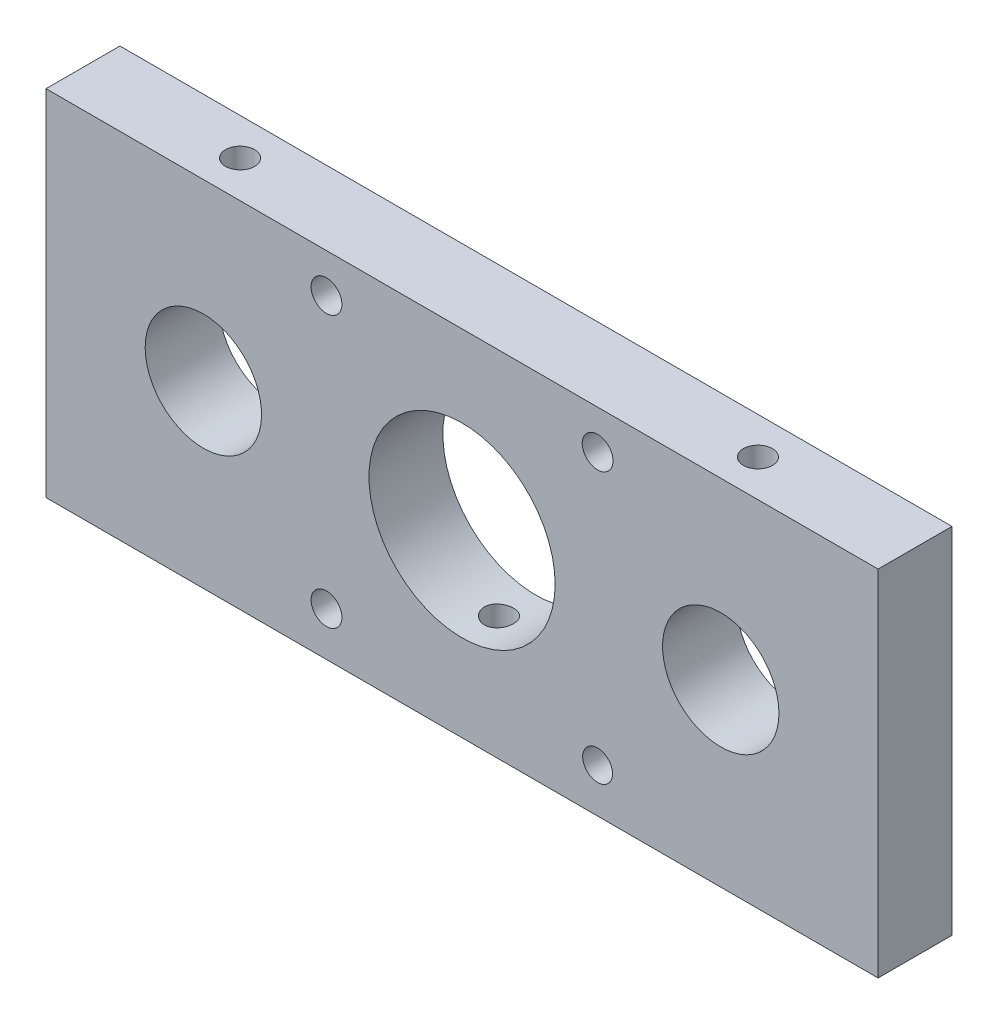
ISO-10303-21;
HEADER;
FILE_DESCRIPTION(('STEP AP214'),'2;1');
FILE_NAME('part.step','',(''),(''),'','','');
FILE_SCHEMA(('AUTOMOTIVE_DESIGN { 1 0 10303 214 1 1 1 1 }'));
ENDSEC;
DATA;
#1=APPLICATION_CONTEXT('core data for automotive mechanical design processes');
#2=APPLICATION_PROTOCOL_DEFINITION('international standard','automotive_design',2000,#1);
#3=PRODUCT_CONTEXT('',#1,'mechanical');
#4=PRODUCT('Part','Part','',(#3));
#5=PRODUCT_RELATED_PRODUCT_CATEGORY('part','',(#4));
#6=PRODUCT_DEFINITION_FORMATION('','',#4);
#7=PRODUCT_DEFINITION_CONTEXT('part definition',#1,'design');
#8=PRODUCT_DEFINITION('design','',#6,#7);
#9=PRODUCT_DEFINITION_SHAPE('','',#8);
#10=(LENGTH_UNIT() NAMED_UNIT(*) SI_UNIT(.MILLI.,.METRE.));
#11=(NAMED_UNIT(*) PLANE_ANGLE_UNIT() SI_UNIT($,.RADIAN.));
#12=(NAMED_UNIT(*) SI_UNIT($,.STERADIAN.) SOLID_ANGLE_UNIT());
#13=UNCERTAINTY_MEASURE_WITH_UNIT(LENGTH_MEASURE(1.E-05),#10,'distance_accuracy_value','');
#14=(GEOMETRIC_REPRESENTATION_CONTEXT(3) GLOBAL_UNCERTAINTY_ASSIGNED_CONTEXT((#13)) GLOBAL_UNIT_ASSIGNED_CONTEXT((#10,
#11,#12)) REPRESENTATION_CONTEXT('',''));
#15=CARTESIAN_POINT('',(0.,0.,0.));
#16=DIRECTION('',(0.,0.,1.));
#17=DIRECTION('',(1.,0.,0.));
#18=AXIS2_PLACEMENT_3D('',#15,#16,#17);
#19=CARTESIAN_POINT('',(-71.505,27.,10.));
#20=DIRECTION('',(1.,0.,0.));
#21=DIRECTION('',(0.,0.,-1.));
#22=AXIS2_PLACEMENT_3D('',#19,#20,#21);
#23=PLANE('',#22);
#24=DIRECTION('',(0.,-1.,0.));
#25=VECTOR('',#24,1.);
#26=CARTESIAN_POINT('',(-71.505,27.,10.));
#27=LINE('',#26,#25);
#28=CARTESIAN_POINT('',(-71.505,30.,10.));
#29=VERTEX_POINT('',#28);
#30=CARTESIAN_POINT('',(-71.505,-30.87,10.));
#31=VERTEX_POINT('',#30);
#32=EDGE_CURVE('E43',#29,#31,#27,.T.);
#33=ORIENTED_EDGE('',*,*,#32,.F.);
#34=DIRECTION('',(0.,0.,1.));
#35=VECTOR('',#34,1.);
#36=CARTESIAN_POINT('',(-71.505,30.,-145.741462870036));
#37=LINE('',#36,#35);
#38=CARTESIAN_POINT('',(-71.505,30.,-2.70000000000001));
#39=VERTEX_POINT('',#38);
#40=EDGE_CURVE('E77',#39,#29,#37,.T.);
#41=ORIENTED_EDGE('',*,*,#40,.F.);
#42=DIRECTION('',(0.,-1.,0.));
#43=VECTOR('',#42,1.);
#44=CARTESIAN_POINT('',(-71.505,27.,-2.7));
#45=LINE('',#44,#43);
#46=CARTESIAN_POINT('',(-71.505,-30.87,-2.69999999999999));
#47=VERTEX_POINT('',#46);
#48=EDGE_CURVE('E123',#39,#47,#45,.T.);
#49=ORIENTED_EDGE('',*,*,#48,.T.);
#50=DIRECTION('',(0.,0.,1.));
#51=VECTOR('',#50,1.);
#52=CARTESIAN_POINT('',(-71.505,-30.87,0.));
#53=LINE('',#52,#51);
#54=EDGE_CURVE('E80',#47,#31,#53,.T.);
#55=ORIENTED_EDGE('',*,*,#54,.T.);
#56=EDGE_LOOP('',(#33,#41,#49,#55));
#57=FACE_BOUND('',#56,.T.);
#58=ADVANCED_FACE('F31',(#57),#23,.F.);
#59=CARTESIAN_POINT('',(71.505,27.,10.));
#60=DIRECTION('',(-1.,0.,0.));
#61=DIRECTION('',(0.,0.,1.));
#62=AXIS2_PLACEMENT_3D('',#59,#60,#61);
#63=PLANE('',#62);
#64=DIRECTION('',(0.,1.,0.));
#65=VECTOR('',#64,1.);
#66=CARTESIAN_POINT('',(71.505,27.,10.));
#67=LINE('',#66,#65);
#68=CARTESIAN_POINT('',(71.505,-30.87,10.));
#69=VERTEX_POINT('',#68);
#70=CARTESIAN_POINT('',(71.505,30.,10.));
#71=VERTEX_POINT('',#70);
#72=EDGE_CURVE('E11',#69,#71,#67,.T.);
#73=ORIENTED_EDGE('',*,*,#72,.F.);
#74=DIRECTION('',(0.,0.,-1.));
#75=VECTOR('',#74,1.);
#76=CARTESIAN_POINT('',(71.505,-30.87,0.));
#77=LINE('',#76,#75);
#78=CARTESIAN_POINT('',(71.505,-30.87,-2.69999999999999));
#79=VERTEX_POINT('',#78);
#80=EDGE_CURVE('E51',#69,#79,#77,.T.);
#81=ORIENTED_EDGE('',*,*,#80,.T.);
#82=DIRECTION('',(0.,1.,0.));
#83=VECTOR('',#82,1.);
#84=CARTESIAN_POINT('',(71.505,27.,-2.7));
#85=LINE('',#84,#83);
#86=CARTESIAN_POINT('',(71.505,30.,-2.70000000000001));
#87=VERTEX_POINT('',#86);
#88=EDGE_CURVE('E120',#79,#87,#85,.T.);
#89=ORIENTED_EDGE('',*,*,#88,.T.);
#90=DIRECTION('',(0.,0.,1.));
#91=VECTOR('',#90,1.);
#92=CARTESIAN_POINT('',(71.505,30.,-145.741462870036));
#93=LINE('',#92,#91);
#94=EDGE_CURVE('E97',#87,#71,#93,.T.);
#95=ORIENTED_EDGE('',*,*,#94,.T.);
#96=EDGE_LOOP('',(#73,#81,#89,#95));
#97=FACE_BOUND('',#96,.T.);
#98=ADVANCED_FACE('F153',(#97),#63,.F.);
#99=CARTESIAN_POINT('',(-71.505,-27.,10.));
#100=DIRECTION('',(0.,0.,1.));
#101=DIRECTION('',(1.,0.,0.));
#102=AXIS2_PLACEMENT_3D('',#99,#100,#101);
#103=PLANE('',#102);
#104=CARTESIAN_POINT('',(-23.3,23.2999999999833,10.));
#105=DIRECTION('',(0.,0.,1.));
#106=DIRECTION('',(1.,0.,0.));
#107=AXIS2_PLACEMENT_3D('',#104,#105,#106);
#108=CIRCLE('',#107,2.65000000000001);
#109=CARTESIAN_POINT('',(-20.65,23.2999999999833,10.));
#110=VERTEX_POINT('',#109);
#111=EDGE_CURVE('E377',#110,#110,#108,.T.);
#112=ORIENTED_EDGE('',*,*,#111,.F.);
#113=EDGE_LOOP('',(#112));
#114=FACE_BOUND('',#113,.T.);
#115=CARTESIAN_POINT('',(-23.3,-23.3000000000167,10.));
#116=DIRECTION('',(0.,0.,1.));
#117=DIRECTION('',(1.,0.,0.));
#118=AXIS2_PLACEMENT_3D('',#115,#116,#117);
#119=CIRCLE('',#118,2.65000000000001);
#120=CARTESIAN_POINT('',(-20.65,-23.3000000000167,10.));
#121=VERTEX_POINT('',#120);
#122=EDGE_CURVE('E371',#121,#121,#119,.T.);
#123=ORIENTED_EDGE('',*,*,#122,.F.);
#124=EDGE_LOOP('',(#123));
#125=FACE_BOUND('',#124,.T.);
#126=CARTESIAN_POINT('',(23.3,23.2999999999833,10.));
#127=DIRECTION('',(0.,0.,1.));
#128=DIRECTION('',(1.,0.,0.));
#129=AXIS2_PLACEMENT_3D('',#126,#127,#128);
#130=CIRCLE('',#129,2.64999999999999);
#131=CARTESIAN_POINT('',(25.95,23.2999999999833,10.));
#132=VERTEX_POINT('',#131);
#133=EDGE_CURVE('E365',#132,#132,#130,.T.);
#134=ORIENTED_EDGE('',*,*,#133,.F.);
#135=EDGE_LOOP('',(#134));
#136=FACE_BOUND('',#135,.T.);
#137=CARTESIAN_POINT('',(23.3,-23.3000000000167,10.));
#138=DIRECTION('',(0.,0.,1.));
#139=DIRECTION('',(1.,0.,0.));
#140=AXIS2_PLACEMENT_3D('',#137,#138,#139);
#141=CIRCLE('',#140,2.56848992898384);
#142=CARTESIAN_POINT('',(25.8684899289839,-23.3000000000167,10.));
#143=VERTEX_POINT('',#142);
#144=EDGE_CURVE('E359',#143,#143,#141,.T.);
#145=ORIENTED_EDGE('',*,*,#144,.F.);
#146=EDGE_LOOP('',(#145));
#147=FACE_BOUND('',#146,.T.);
#148=CARTESIAN_POINT('',(-44.465,0.,10.));
#149=DIRECTION('',(0.,0.,1.));
#150=DIRECTION('',(-1.,0.,0.));
#151=AXIS2_PLACEMENT_3D('',#148,#149,#150);
#152=CIRCLE('',#151,10.);
#153=CARTESIAN_POINT('',(-54.465,0.,10.));
#154=VERTEX_POINT('',#153);
#155=EDGE_CURVE('E108',#154,#154,#152,.T.);
#156=ORIENTED_EDGE('',*,*,#155,.F.);
#157=EDGE_LOOP('',(#156));
#158=FACE_BOUND('',#157,.T.);
#159=CARTESIAN_POINT('',(44.465,0.,10.));
#160=DIRECTION('',(0.,0.,1.));
#161=DIRECTION('',(1.,0.,0.));
#162=AXIS2_PLACEMENT_3D('',#159,#160,#161);
#163=CIRCLE('',#162,10.);
#164=CARTESIAN_POINT('',(54.465,0.,10.));
#165=VERTEX_POINT('',#164);
#166=EDGE_CURVE('E112',#165,#165,#163,.T.);
#167=ORIENTED_EDGE('',*,*,#166,.F.);
#168=EDGE_LOOP('',(#167));
#169=FACE_BOUND('',#168,.T.);
#170=CARTESIAN_POINT('',(0.,0.,10.));
#171=DIRECTION('',(0.,0.,1.));
#172=DIRECTION('',(1.,0.,0.));
#173=AXIS2_PLACEMENT_3D('',#170,#171,#172);
#174=CIRCLE('',#173,16.);
#175=CARTESIAN_POINT('',(16.,0.,10.));
#176=VERTEX_POINT('',#175);
#177=EDGE_CURVE('E116',#176,#176,#174,.T.);
#178=ORIENTED_EDGE('',*,*,#177,.F.);
#179=EDGE_LOOP('',(#178));
#180=FACE_BOUND('',#179,.T.);
#181=ORIENTED_EDGE('',*,*,#32,.T.);
#182=DIRECTION('',(1.,0.,0.));
#183=VECTOR('',#182,1.);
#184=CARTESIAN_POINT('',(-71.505,-30.87,10.));
#185=LINE('',#184,#183);
#186=EDGE_CURVE('E93',#31,#69,#185,.T.);
#187=ORIENTED_EDGE('',*,*,#186,.T.);
#188=ORIENTED_EDGE('',*,*,#72,.T.);
#189=DIRECTION('',(-1.,0.,0.));
#190=VECTOR('',#189,1.);
#191=CARTESIAN_POINT('',(-71.505,30.,10.));
#192=LINE('',#191,#190);
#193=EDGE_CURVE('E90',#71,#29,#192,.T.);
#194=ORIENTED_EDGE('',*,*,#193,.T.);
#195=EDGE_LOOP('',(#181,#187,#188,#194));
#196=FACE_BOUND('',#195,.T.);
#197=ADVANCED_FACE('F95',(#114,#125,#136,#147,#158,#169,#180,#196),#103,.T.);
#198=CARTESIAN_POINT('',(129.437951763224,-30.87,0.));
#199=DIRECTION('',(0.,-1.,0.));
#200=DIRECTION('',(0.,0.,-1.));
#201=AXIS2_PLACEMENT_3D('',#198,#199,#200);
#202=PLANE('',#201);
#203=CARTESIAN_POINT('',(61.505,-30.87,3.65000000000002));
#204=DIRECTION('',(0.,-1.,0.));
#205=DIRECTION('',(0.,0.,1.));
#206=AXIS2_PLACEMENT_3D('',#203,#204,#205);
#207=CIRCLE('',#206,2.5);
#208=CARTESIAN_POINT('',(61.505,-30.87,6.15000000000002));
#209=VERTEX_POINT('',#208);
#210=EDGE_CURVE('E356',#209,#209,#207,.T.);
#211=ORIENTED_EDGE('',*,*,#210,.F.);
#212=EDGE_LOOP('',(#211));
#213=FACE_BOUND('',#212,.T.);
#214=CARTESIAN_POINT('',(33.505,-30.87,3.65000000000001));
#215=DIRECTION('',(0.,-1.,0.));
#216=DIRECTION('',(0.,0.,1.));
#217=AXIS2_PLACEMENT_3D('',#214,#215,#216);
#218=CIRCLE('',#217,2.49999999999999);
#219=CARTESIAN_POINT('',(33.505,-30.87,6.15000000000001));
#220=VERTEX_POINT('',#219);
#221=EDGE_CURVE('E350',#220,#220,#218,.T.);
#222=ORIENTED_EDGE('',*,*,#221,.F.);
#223=EDGE_LOOP('',(#222));
#224=FACE_BOUND('',#223,.T.);
#225=CARTESIAN_POINT('',(-33.505,-30.87,3.65));
#226=DIRECTION('',(0.,-1.,0.));
#227=DIRECTION('',(0.,0.,-1.));
#228=AXIS2_PLACEMENT_3D('',#225,#226,#227);
#229=CIRCLE('',#228,2.5);
#230=CARTESIAN_POINT('',(-33.505,-30.87,1.15));
#231=VERTEX_POINT('',#230);
#232=EDGE_CURVE('E344',#231,#231,#229,.T.);
#233=ORIENTED_EDGE('',*,*,#232,.F.);
#234=EDGE_LOOP('',(#233));
#235=FACE_BOUND('',#234,.T.);
#236=CARTESIAN_POINT('',(0.,-30.87,3.65));
#237=DIRECTION('',(0.,-1.,0.));
#238=DIRECTION('',(0.,0.,-1.));
#239=AXIS2_PLACEMENT_3D('',#236,#237,#238);
#240=CIRCLE('',#239,2.5);
#241=CARTESIAN_POINT('',(0.,-30.87,1.15));
#242=VERTEX_POINT('',#241);
#243=EDGE_CURVE('E337',#242,#242,#240,.T.);
#244=ORIENTED_EDGE('',*,*,#243,.F.);
#245=EDGE_LOOP('',(#244));
#246=FACE_BOUND('',#245,.T.);
#247=CARTESIAN_POINT('',(-61.505,-30.87,3.65));
#248=DIRECTION('',(0.,-1.,0.));
#249=DIRECTION('',(0.,0.,-1.));
#250=AXIS2_PLACEMENT_3D('',#247,#248,#249);
#251=CIRCLE('',#250,2.5);
#252=CARTESIAN_POINT('',(-61.505,-30.87,1.15));
#253=VERTEX_POINT('',#252);
#254=EDGE_CURVE('E102',#253,#253,#251,.T.);
#255=ORIENTED_EDGE('',*,*,#254,.F.);
#256=EDGE_LOOP('',(#255));
#257=FACE_BOUND('',#256,.T.);
#258=ORIENTED_EDGE('',*,*,#80,.F.);
#259=ORIENTED_EDGE('',*,*,#186,.F.);
#260=ORIENTED_EDGE('',*,*,#54,.F.);
#261=DIRECTION('',(-1.,0.,0.));
#262=VECTOR('',#261,1.);
#263=CARTESIAN_POINT('',(129.437951763224,-30.87,-2.69999999999999));
#264=LINE('',#263,#262);
#265=EDGE_CURVE('E58',#79,#47,#264,.T.);
#266=ORIENTED_EDGE('',*,*,#265,.F.);
#267=EDGE_LOOP('',(#258,#259,#260,#266));
#268=FACE_BOUND('',#267,.T.);
#269=ADVANCED_FACE('F140',(#213,#224,#235,#246,#257,#268),#202,.T.);
#270=CARTESIAN_POINT('',(129.437951763224,27.,-2.7));
#271=DIRECTION('',(0.,0.,-1.));
#272=DIRECTION('',(0.,1.,0.));
#273=AXIS2_PLACEMENT_3D('',#270,#271,#272);
#274=PLANE('',#273);
#275=CARTESIAN_POINT('',(-23.3,23.2999999999833,-2.7));
#276=DIRECTION('',(0.,0.,-1.));
#277=DIRECTION('',(0.,1.,0.));
#278=AXIS2_PLACEMENT_3D('',#275,#276,#277);
#279=CIRCLE('',#278,2.65000000000001);
#280=CARTESIAN_POINT('',(-23.3,25.9499999999833,-2.7));
#281=VERTEX_POINT('',#280);
#282=EDGE_CURVE('E380',#281,#281,#279,.F.);
#283=ORIENTED_EDGE('',*,*,#282,.T.);
#284=EDGE_LOOP('',(#283));
#285=FACE_BOUND('',#284,.T.);
#286=CARTESIAN_POINT('',(-23.3,-23.3000000000167,-2.69999999999999));
#287=DIRECTION('',(0.,0.,-1.));
#288=DIRECTION('',(0.,1.,0.));
#289=AXIS2_PLACEMENT_3D('',#286,#287,#288);
#290=CIRCLE('',#289,2.65000000000001);
#291=CARTESIAN_POINT('',(-23.3,-20.6500000000167,-2.69999999999999));
#292=VERTEX_POINT('',#291);
#293=EDGE_CURVE('E374',#292,#292,#290,.F.);
#294=ORIENTED_EDGE('',*,*,#293,.T.);
#295=EDGE_LOOP('',(#294));
#296=FACE_BOUND('',#295,.T.);
#297=CARTESIAN_POINT('',(23.3,23.2999999999833,-2.7));
#298=DIRECTION('',(0.,0.,-1.));
#299=DIRECTION('',(0.,1.,0.));
#300=AXIS2_PLACEMENT_3D('',#297,#298,#299);
#301=CIRCLE('',#300,2.64999999999999);
#302=CARTESIAN_POINT('',(23.3,25.9499999999833,-2.7));
#303=VERTEX_POINT('',#302);
#304=EDGE_CURVE('E368',#303,#303,#301,.F.);
#305=ORIENTED_EDGE('',*,*,#304,.T.);
#306=EDGE_LOOP('',(#305));
#307=FACE_BOUND('',#306,.T.);
#308=CARTESIAN_POINT('',(23.3,-23.3000000000167,-2.69999999999999));
#309=DIRECTION('',(0.,0.,-1.));
#310=DIRECTION('',(0.,1.,0.));
#311=AXIS2_PLACEMENT_3D('',#308,#309,#310);
#312=CIRCLE('',#311,2.56848992898384);
#313=CARTESIAN_POINT('',(23.3,-20.7315100710328,-2.69999999999999));
#314=VERTEX_POINT('',#313);
#315=EDGE_CURVE('E362',#314,#314,#312,.F.);
#316=ORIENTED_EDGE('',*,*,#315,.T.);
#317=EDGE_LOOP('',(#316));
#318=FACE_BOUND('',#317,.T.);
#319=CARTESIAN_POINT('',(-44.465,0.,-2.7));
#320=DIRECTION('',(0.,0.,-1.));
#321=DIRECTION('',(0.,1.,0.));
#322=AXIS2_PLACEMENT_3D('',#319,#320,#321);
#323=CIRCLE('',#322,10.);
#324=CARTESIAN_POINT('',(-44.465,10.,-2.7));
#325=VERTEX_POINT('',#324);
#326=EDGE_CURVE('E111',#325,#325,#323,.T.);
#327=ORIENTED_EDGE('',*,*,#326,.F.);
#328=EDGE_LOOP('',(#327));
#329=FACE_BOUND('',#328,.T.);
#330=CARTESIAN_POINT('',(44.465,0.,-2.7));
#331=DIRECTION('',(0.,0.,-1.));
#332=DIRECTION('',(0.,1.,0.));
#333=AXIS2_PLACEMENT_3D('',#330,#331,#332);
#334=CIRCLE('',#333,10.);
#335=CARTESIAN_POINT('',(44.465,10.,-2.7));
#336=VERTEX_POINT('',#335);
#337=EDGE_CURVE('E115',#336,#336,#334,.T.);
#338=ORIENTED_EDGE('',*,*,#337,.F.);
#339=EDGE_LOOP('',(#338));
#340=FACE_BOUND('',#339,.T.);
#341=CARTESIAN_POINT('',(0.,0.,-2.7));
#342=DIRECTION('',(0.,0.,-1.));
#343=DIRECTION('',(0.,1.,0.));
#344=AXIS2_PLACEMENT_3D('',#341,#342,#343);
#345=CIRCLE('',#344,16.);
#346=CARTESIAN_POINT('',(0.,16.,-2.7));
#347=VERTEX_POINT('',#346);
#348=EDGE_CURVE('E119',#347,#347,#345,.T.);
#349=ORIENTED_EDGE('',*,*,#348,.F.);
#350=EDGE_LOOP('',(#349));
#351=FACE_BOUND('',#350,.T.);
#352=ORIENTED_EDGE('',*,*,#88,.F.);
#353=ORIENTED_EDGE('',*,*,#265,.T.);
#354=ORIENTED_EDGE('',*,*,#48,.F.);
#355=DIRECTION('',(-1.,0.,0.));
#356=VECTOR('',#355,1.);
#357=CARTESIAN_POINT('',(-71.505,30.,-2.70000000000001));
#358=LINE('',#357,#356);
#359=EDGE_CURVE('E92',#87,#39,#358,.T.);
#360=ORIENTED_EDGE('',*,*,#359,.F.);
#361=EDGE_LOOP('',(#352,#353,#354,#360));
#362=FACE_BOUND('',#361,.T.);
#363=ADVANCED_FACE('F136',(#285,#296,#307,#318,#329,#340,#351,#362),#274,.T.);
#364=CARTESIAN_POINT('',(0.,0.,-9.));
#365=DIRECTION('',(0.,0.,1.));
#366=DIRECTION('',(1.,0.,0.));
#367=AXIS2_PLACEMENT_3D('',#364,#365,#366);
#368=CYLINDRICAL_SURFACE('',#367,16.);
#369=CARTESIAN_POINT('',(0.,-16.,1.15));
#370=CARTESIAN_POINT('',(0.139515097271033,-15.9999977019448,1.15000569827152));
#371=CARTESIAN_POINT('',(0.279109404865704,-15.9981561248574,1.16171811377356));
#372=CARTESIAN_POINT('',(0.554391314978102,-15.9909869809759,1.20824369127676));
#373=CARTESIAN_POINT('',(0.690075061323317,-15.9856560884472,1.24307889250351));
#374=CARTESIAN_POINT('',(0.953512538047403,-15.9721069716578,1.33477966280662));
#375=CARTESIAN_POINT('',(1.0812723522899,-15.9638909956317,1.39162808136161));
#376=CARTESIAN_POINT('',(1.3254212510446,-15.9454779403815,1.52569854514161));
#377=CARTESIAN_POINT('',(1.44181181036831,-15.9352811186255,1.60291794303595));
#378=CARTESIAN_POINT('',(1.66091991165162,-15.9139426841436,1.77623304835396));
#379=CARTESIAN_POINT('',(1.76352747914264,-15.9027945139234,1.87246699489025));
#380=CARTESIAN_POINT('',(1.95120768822823,-15.8808607613029,2.08078194826889));
#381=CARTESIAN_POINT('',(2.03627928654192,-15.8700752005075,2.1928638973002));
#382=CARTESIAN_POINT('',(2.18690544328884,-15.8500242812745,2.43043827134373));
#383=CARTESIAN_POINT('',(2.25235273557991,-15.840767397861,2.5559994823618));
#384=CARTESIAN_POINT('',(2.36118681597065,-15.8249120174236,2.81650141085781));
#385=CARTESIAN_POINT('',(2.40457491010063,-15.8183133630222,2.95144157251056));
#386=CARTESIAN_POINT('',(2.46771559322167,-15.8085863451104,3.22571090114379));
#387=CARTESIAN_POINT('',(2.48765705487496,-15.8054302653236,3.3649955858188));
#388=CARTESIAN_POINT('',(2.50392369757621,-15.8028617107177,3.64496718889265));
#389=CARTESIAN_POINT('',(2.50025034860466,-15.8034490028802,3.78565401946604));
#390=CARTESIAN_POINT('',(2.4695458080889,-15.8082755045521,4.06309703185269));
#391=CARTESIAN_POINT('',(2.44272562959693,-15.8124817218495,4.19987722335315));
#392=CARTESIAN_POINT('',(2.36681937833752,-15.8240205634547,4.46697200635933));
#393=CARTESIAN_POINT('',(2.31773262684132,-15.8313532830641,4.59728640064054));
#394=CARTESIAN_POINT('',(2.19846916949384,-15.8483550685462,4.84838871267716));
#395=CARTESIAN_POINT('',(2.12820372315549,-15.8580339308724,4.96913379177307));
#396=CARTESIAN_POINT('',(1.96864058146637,-15.878630461501,5.19719953568554));
#397=CARTESIAN_POINT('',(1.87934153253016,-15.8895482178821,5.30451924488747));
#398=CARTESIAN_POINT('',(1.68309088822333,-15.911537862489,5.50391024663332));
#399=CARTESIAN_POINT('',(1.57595800560539,-15.9226101363559,5.59580315826946));
#400=CARTESIAN_POINT('',(1.34769694737936,-15.9435512534783,5.7603331456399));
#401=CARTESIAN_POINT('',(1.22656870068132,-15.9534200906202,5.83297012355683));
#402=CARTESIAN_POINT('',(0.973595927056491,-15.9708539902704,5.9569380734224));
#403=CARTESIAN_POINT('',(0.841744186240461,-15.9784174854193,6.008254558533));
#404=CARTESIAN_POINT('',(0.571149534696759,-15.9903756000068,6.08796596744723));
#405=CARTESIAN_POINT('',(0.4324071306872,-15.9947704520898,6.11636257406648));
#406=CARTESIAN_POINT('',(0.153508336763735,-15.9998651172728,6.14918927645019));
#407=CARTESIAN_POINT('',(0.0133814615087016,-16.0006027179286,6.15386447897619));
#408=CARTESIAN_POINT('',(-0.265654546411642,-15.9984028649127,6.13976729466403));
#409=CARTESIAN_POINT('',(-0.404563719925156,-15.9954655349964,6.1209956974109));
#410=CARTESIAN_POINT('',(-0.676473446265705,-15.9862692369322,6.06074161231983));
#411=CARTESIAN_POINT('',(-0.809501262056042,-15.9800278421539,6.01937924173227));
#412=CARTESIAN_POINT('',(-1.06673406785663,-15.9649207568356,5.91524490560121));
#413=CARTESIAN_POINT('',(-1.19093861303941,-15.9560549341007,5.85247186155733));
#414=CARTESIAN_POINT('',(-1.42807220225041,-15.9365897274094,5.70672800887343));
#415=CARTESIAN_POINT('',(-1.54090512378372,-15.9259772866342,5.62360257990953));
#416=CARTESIAN_POINT('',(-1.75110696507806,-15.9042388046444,5.43972791409221));
#417=CARTESIAN_POINT('',(-1.84847490447018,-15.8931127309268,5.33897756079515));
#418=CARTESIAN_POINT('',(-2.02588080776691,-15.8714802753665,5.12161880278279));
#419=CARTESIAN_POINT('',(-2.10575398584126,-15.860980411908,5.00487515287767));
#420=CARTESIAN_POINT('',(-2.2447556772664,-15.8419069280583,4.75948392633867));
#421=CARTESIAN_POINT('',(-2.30388478778105,-15.83333325222,4.63083669251053));
#422=CARTESIAN_POINT('',(-2.39946771944995,-15.8191307135236,4.36577035928581));
#423=CARTESIAN_POINT('',(-2.43600654947912,-15.8134908234896,4.22938253123438));
#424=CARTESIAN_POINT('',(-2.48564122040535,-15.8057657028079,3.95231085633602));
#425=CARTESIAN_POINT('',(-2.49873883084997,-15.8036802038444,3.811627334581));
#426=CARTESIAN_POINT('',(-2.50107452690756,-15.8033105804488,3.53160128409253));
#427=CARTESIAN_POINT('',(-2.49057180548425,-15.804985160429,3.3922609030665));
#428=CARTESIAN_POINT('',(-2.44656223255901,-15.8118569894183,3.11735470285572));
#429=CARTESIAN_POINT('',(-2.41305543086961,-15.8170542307995,2.98178887549829));
#430=CARTESIAN_POINT('',(-2.32408329891852,-15.8303708885491,2.71836217335948));
#431=CARTESIAN_POINT('',(-2.26863761738581,-15.8384876895341,2.59049452174159));
#432=CARTESIAN_POINT('',(-2.13738768546417,-15.856731840474,2.34583438632373));
#433=CARTESIAN_POINT('',(-2.06158262820886,-15.8668592701083,2.22904234171157));
#434=CARTESIAN_POINT('',(-1.8908300813908,-15.8881156809226,2.00853445587317));
#435=CARTESIAN_POINT('',(-1.79569107094768,-15.8992540116029,1.90496780338617));
#436=CARTESIAN_POINT('',(-1.58937594638204,-15.9212004364073,1.71517876361327));
#437=CARTESIAN_POINT('',(-1.47819612078432,-15.9320084534012,1.62896040140813));
#438=CARTESIAN_POINT('',(-1.24216685884341,-15.952151024567,1.47584877696844));
#439=CARTESIAN_POINT('',(-1.11723937214238,-15.9614763443027,1.40907462724039));
#440=CARTESIAN_POINT('',(-0.857851882357782,-15.9775125983888,1.29755900380706));
#441=CARTESIAN_POINT('',(-0.723401776581761,-15.9842262014212,1.25279502744161));
#442=CARTESIAN_POINT('',(-0.490314239911593,-15.9927744586488,1.19656697890942));
#443=CARTESIAN_POINT('',(-0.393105575651624,-15.9954699162612,1.179131509371));
#444=CARTESIAN_POINT('',(-0.197277797850581,-15.9990834869762,1.15584608662093));
#445=CARTESIAN_POINT('',(-0.0986587041691182,-16.0000016250796,1.14999597044267));
#446=CARTESIAN_POINT('',(0.,-16.,1.15));
#447=B_SPLINE_CURVE_WITH_KNOTS('',3,(#369,#370,#371,#372,#373,#374,#375,#376,#377,#378,#379,
#380,#381,#382,#383,#384,#385,#386,#387,#388,#389,#390,#391,#392,#393,#394,#395,#396,#397,#398,
#399,#400,#401,#402,#403,#404,#405,#406,#407,#408,#409,#410,#411,#412,#413,#414,#415,#416,#417,
#418,#419,#420,#421,#422,#423,#424,#425,#426,#427,#428,#429,#430,#431,#432,#433,#434,#435,#436,
#437,#438,#439,#440,#441,#442,#443,#444,#445,#446),.UNSPECIFIED.,.T.,.F.,(4,2,2,2,2,2,2,2,2,2,2,
2,2,2,2,2,2,2,2,2,2,2,2,2,2,2,2,2,2,2,2,2,2,2,2,2,2,2,4),(0.,0.41818474047749,0.836768642528014,
1.25502707944103,1.6732311879203,2.09459568152199,2.51598523645422,2.93963778605759,
3.36326525009238,3.78345631134994,4.20362121670545,4.6199957602258,5.0363829965105,
5.45453977402347,5.87272629892068,6.29545732334367,6.71819049513827,7.14121043754564,
7.56419931829866,7.98280854005914,8.40140366528356,8.81779444756567,9.23420620742031,
9.65388541469671,10.0735912160142,10.4970948024959,10.9205861964898,11.3424741039513,
11.764330162293,12.1815758159869,12.598820566189,13.0156924696662,13.4325808967135,
13.8538201231554,14.275156971423,14.6990230419984,15.1224548565628,15.4181801635154,
15.7139013105871),.UNSPECIFIED.);
#448=CARTESIAN_POINT('',(0.,-16.,1.15));
#449=VERTEX_POINT('',#448);
#450=EDGE_CURVE('E34',#449,#449,#447,.T.);
#451=ORIENTED_EDGE('',*,*,#450,.T.);
#452=EDGE_LOOP('',(#451));
#453=FACE_BOUND('',#452,.T.);
#454=ORIENTED_EDGE('',*,*,#348,.T.);
#455=EDGE_LOOP('',(#454));
#456=FACE_BOUND('',#455,.T.);
#457=ORIENTED_EDGE('',*,*,#177,.T.);
#458=EDGE_LOOP('',(#457));
#459=FACE_BOUND('',#458,.T.);
#460=ADVANCED_FACE('F139',(#453,#456,#459),#368,.F.);
#461=CARTESIAN_POINT('',(44.465,0.,-9.));
#462=DIRECTION('',(0.,0.,1.));
#463=DIRECTION('',(1.,0.,0.));
#464=AXIS2_PLACEMENT_3D('',#461,#462,#463);
#465=CYLINDRICAL_SURFACE('',#464,10.);
#466=CARTESIAN_POINT('',(44.505,9.99991999968,6.15));
#467=CARTESIAN_POINT('',(44.3669548259788,10.0004698821918,6.14999616793432));
#468=CARTESIAN_POINT('',(44.2288553490215,9.9981376170315,6.13852773891173));
#469=CARTESIAN_POINT('',(43.9565905995627,9.98799856043913,6.09301468074264));
#470=CARTESIAN_POINT('',(43.8224275580513,9.98018872471235,6.05895749791211));
#471=CARTESIAN_POINT('',(43.5620078908397,9.96000260380894,5.96941853586122));
#472=CARTESIAN_POINT('',(43.4357421929127,9.94763167531546,5.91396188526653));
#473=CARTESIAN_POINT('',(43.1942977860448,9.91968278598086,5.78328615171642));
#474=CARTESIAN_POINT('',(43.0791194582521,9.90410471494625,5.70806638970014));
#475=CARTESIAN_POINT('',(42.8607972663723,9.871117318887,5.53839972495474));
#476=CARTESIAN_POINT('',(42.7579088526534,9.8536799600664,5.44362956271289));
#477=CARTESIAN_POINT('',(42.569303811996,9.81914198865345,5.23824527874338));
#478=CARTESIAN_POINT('',(42.4835891214644,9.80204141423069,5.12762937275274));
#479=CARTESIAN_POINT('',(42.3305084607022,9.76986062155121,4.89163656004045));
#480=CARTESIAN_POINT('',(42.2634402246532,9.75481494606401,4.76606137071969));
#481=CARTESIAN_POINT('',(42.151459581533,9.72886720759888,4.50499271561034));
#482=CARTESIAN_POINT('',(42.106543799448,9.71796451347952,4.36950076429409));
#483=CARTESIAN_POINT('',(42.0409939314227,9.70182061997837,4.09517433377706));
#484=CARTESIAN_POINT('',(42.0199131572666,9.69647542766101,3.95645285915038));
#485=CARTESIAN_POINT('',(42.0012415369491,9.69174877574522,3.67734725610163));
#486=CARTESIAN_POINT('',(42.0036469715907,9.69236637189947,3.53696339444614));
#487=CARTESIAN_POINT('',(42.0315169764115,9.6993994259806,3.26202082146126));
#488=CARTESIAN_POINT('',(42.0564365369921,9.70567784259387,3.12740280667998));
#489=CARTESIAN_POINT('',(42.1277569908658,9.72309774841125,2.86431897596894));
#490=CARTESIAN_POINT('',(42.174159388899,9.73423957826429,2.73585359168859));
#491=CARTESIAN_POINT('',(42.2875919678089,9.76024051304305,2.48726506723475));
#492=CARTESIAN_POINT('',(42.3548194893774,9.77513491419289,2.36723582334542));
#493=CARTESIAN_POINT('',(42.5078595157849,9.80692064506237,2.13996476243791));
#494=CARTESIAN_POINT('',(42.5936751944895,9.8238123155851,2.03272513405851));
#495=CARTESIAN_POINT('',(42.7842668626398,9.85823255179562,1.83097319775224));
#496=CARTESIAN_POINT('',(42.8895005166428,9.87576583397491,1.73689350205563));
#497=CARTESIAN_POINT('',(43.1144695058541,9.90903511456728,1.56763609080138));
#498=CARTESIAN_POINT('',(43.234205203926,9.92477106798929,1.49245884835699));
#499=CARTESIAN_POINT('',(43.4853180980846,9.95269840811346,1.36302581054586));
#500=CARTESIAN_POINT('',(43.6167262053241,9.96487999352093,1.30882773419946));
#501=CARTESIAN_POINT('',(43.8871561250498,9.98420992070298,1.22340448950808));
#502=CARTESIAN_POINT('',(44.0261764818614,9.99135922119313,1.19217494530873));
#503=CARTESIAN_POINT('',(44.3040884620147,9.99964702147524,1.15424320099821));
#504=CARTESIAN_POINT('',(44.4428933959164,10.0009338020087,1.14693726543854));
#505=CARTESIAN_POINT('',(44.7197219191348,9.99771340513728,1.15539242069096));
#506=CARTESIAN_POINT('',(44.8577455739917,9.99320672119364,1.17115154694071));
#507=CARTESIAN_POINT('',(45.1271030269254,9.97895634577211,1.22480177760028));
#508=CARTESIAN_POINT('',(45.2585034581489,9.96928690848698,1.26237972339249));
#509=CARTESIAN_POINT('',(45.5131190161745,9.94574326141393,1.35823075882611));
#510=CARTESIAN_POINT('',(45.6363332816132,9.93186860999727,1.41650602219624));
#511=CARTESIAN_POINT('',(45.8735969871562,9.90103246745623,1.55332596878162));
#512=CARTESIAN_POINT('',(45.9874348287662,9.88401864106263,1.63222553202566));
#513=CARTESIAN_POINT('',(46.2004665526556,9.84884933597248,1.80760053249323));
#514=CARTESIAN_POINT('',(46.2996578677355,9.8306936579289,1.90407904429763));
#515=CARTESIAN_POINT('',(46.4830979920096,9.79470514908878,2.11471316601699));
#516=CARTESIAN_POINT('',(46.5669183880459,9.77689129657865,2.22924576977104));
#517=CARTESIAN_POINT('',(46.7141425273518,9.74407868238983,2.47113143886947));
#518=CARTESIAN_POINT('',(46.7775472719089,9.72907978266657,2.5984838750617));
#519=CARTESIAN_POINT('',(46.8816203431997,9.70375257750613,2.86161355586506));
#520=CARTESIAN_POINT('',(46.9224394352443,9.6933933915,2.99732804550052));
#521=CARTESIAN_POINT('',(46.9805993507652,9.67846468213244,3.27399734948423));
#522=CARTESIAN_POINT('',(46.9979454800378,9.67389385039431,3.41495097218222));
#523=CARTESIAN_POINT('',(47.0083901756065,9.67115245697076,3.69361408224318));
#524=CARTESIAN_POINT('',(47.0021926354644,9.67279609209365,3.83129579805981));
#525=CARTESIAN_POINT('',(46.9673366209441,9.68187117297628,4.10358179241461));
#526=CARTESIAN_POINT('',(46.9386786167522,9.68930249757681,4.23818613531364));
#527=CARTESIAN_POINT('',(46.8600981828794,9.70902250110525,4.49973507088601));
#528=CARTESIAN_POINT('',(46.8103069142234,9.72128118627893,4.62672148562314));
#529=CARTESIAN_POINT('',(46.6909791435899,9.74929517372758,4.87062908921755));
#530=CARTESIAN_POINT('',(46.6214398484236,9.76505097057009,4.98754885118231));
#531=CARTESIAN_POINT('',(46.462398438164,9.79883492011715,5.21139143901404));
#532=CARTESIAN_POINT('',(46.3724106359139,9.81691271086144,5.3179617396789));
#533=CARTESIAN_POINT('',(46.1759764932894,9.85304597171449,5.5147166387758));
#534=CARTESIAN_POINT('',(46.0695261592188,9.87110143533265,5.60489724960488));
#535=CARTESIAN_POINT('',(45.8407432205917,9.90560199508181,5.7679941722994));
#536=CARTESIAN_POINT('',(45.7181463714124,9.92200979942349,5.84054831488891));
#537=CARTESIAN_POINT('',(45.4620967232356,9.95099717245646,5.96389892596067));
#538=CARTESIAN_POINT('',(45.3286517205516,9.96357946016442,6.0147108584068));
#539=CARTESIAN_POINT('',(45.080389776609,9.98167261246351,6.0856416156221));
#540=CARTESIAN_POINT('',(44.9667526889331,9.98806560567038,6.10972203566782));
#541=CARTESIAN_POINT('',(44.7370897374877,9.99695798450155,6.14190221175522));
#542=CARTESIAN_POINT('',(44.6210640618997,9.99945767567381,6.15000322188089));
#543=CARTESIAN_POINT('',(44.505,9.99991999968,6.15));
#544=B_SPLINE_CURVE_WITH_KNOTS('',3,(#466,#467,#468,#469,#470,#471,#472,#473,#474,#475,#476,
#477,#478,#479,#480,#481,#482,#483,#484,#485,#486,#487,#488,#489,#490,#491,#492,#493,#494,#495,
#496,#497,#498,#499,#500,#501,#502,#503,#504,#505,#506,#507,#508,#509,#510,#511,#512,#513,#514,
#515,#516,#517,#518,#519,#520,#521,#522,#523,#524,#525,#526,#527,#528,#529,#530,#531,#532,#533,
#534,#535,#536,#537,#538,#539,#540,#541,#542,#543),.UNSPECIFIED.,.T.,.F.,(4,2,2,2,2,2,2,2,2,2,2,
2,2,2,2,2,2,2,2,2,2,2,2,2,2,2,2,2,2,2,2,2,2,2,2,2,2,2,4),(0.,0.413713965459948,
0.827658045033438,1.24111751692332,1.65459119714624,2.07554602062599,2.49654828178898,
2.92393028728903,3.35124715932349,3.77041565595579,4.18951777555081,4.59873859354311,
5.00798807926459,5.42124084035506,5.83456421867123,6.25928750410915,6.68402141897263,
7.10991571718947,7.53572885503825,7.950709838016,8.36565547712296,8.77478779398799,
9.18396309254756,9.6007045304858,10.0175189271302,10.4446037950689,10.871667713398,
11.2958453711776,11.7199271323936,12.1314311673001,12.5429265880317,12.9519046206052,
13.3609405284492,13.7809544604698,14.2010704452574,14.6292009551107,15.057026452549,
15.4048915086186,15.7527292627191),.UNSPECIFIED.);
#545=CARTESIAN_POINT('',(44.505,9.99991999968,6.15));
#546=VERTEX_POINT('',#545);
#547=EDGE_CURVE('E279',#546,#546,#544,.T.);
#548=ORIENTED_EDGE('',*,*,#547,.F.);
#549=EDGE_LOOP('',(#548));
#550=FACE_BOUND('',#549,.T.);
#551=ORIENTED_EDGE('',*,*,#337,.T.);
#552=EDGE_LOOP('',(#551));
#553=FACE_BOUND('',#552,.T.);
#554=ORIENTED_EDGE('',*,*,#166,.T.);
#555=EDGE_LOOP('',(#554));
#556=FACE_BOUND('',#555,.T.);
#557=ADVANCED_FACE('F232',(#550,#553,#556),#465,.F.);
#558=CARTESIAN_POINT('',(-44.465,0.,-9.));
#559=DIRECTION('',(0.,0.,1.));
#560=DIRECTION('',(1.,0.,0.));
#561=AXIS2_PLACEMENT_3D('',#558,#559,#560);
#562=CYLINDRICAL_SURFACE('',#561,10.);
#563=CARTESIAN_POINT('',(-44.505,9.99991999968,6.15));
#564=CARTESIAN_POINT('',(-44.6432099811864,9.9993647868907,6.14999607994237));
#565=CARTESIAN_POINT('',(-44.7814522339321,9.99592021860298,6.13850016588833));
#566=CARTESIAN_POINT('',(-45.0539509669452,9.98357539781554,6.09290020098506));
#567=CARTESIAN_POINT('',(-45.188205098613,9.97467199487156,6.05878309389395));
#568=CARTESIAN_POINT('',(-45.4487543017858,9.9523521082567,5.96911317597724));
#569=CARTESIAN_POINT('',(-45.5750589309147,9.93894117196235,5.91358670114668));
#570=CARTESIAN_POINT('',(-45.8165522862297,9.90899247912114,5.78276724398531));
#571=CARTESIAN_POINT('',(-45.9317406443809,9.89245461910238,5.70747360751461));
#572=CARTESIAN_POINT('',(-46.1501539333897,9.85762298641147,5.53758283818135));
#573=CARTESIAN_POINT('',(-46.2531119255074,9.83930195641922,5.44264808413056));
#574=CARTESIAN_POINT('',(-46.4418183026853,9.80313425669802,5.23689170909709));
#575=CARTESIAN_POINT('',(-46.5275647426892,9.78528764077951,5.12606829497978));
#576=CARTESIAN_POINT('',(-46.6806134499443,9.75178463824073,4.8896827681849));
#577=CARTESIAN_POINT('',(-46.7476293425659,9.73616387940813,4.7639297464754));
#578=CARTESIAN_POINT('',(-46.8594611303766,9.70926809659239,4.50247793925684));
#579=CARTESIAN_POINT('',(-46.904280746732,9.69799234424701,4.36678082523915));
#580=CARTESIAN_POINT('',(-46.9695157191554,9.68134914459513,4.09231060369475));
#581=CARTESIAN_POINT('',(-46.9904241812854,9.67586250329836,3.9536620833615));
#582=CARTESIAN_POINT('',(-47.0087803490029,9.67105367028295,3.67472512282707));
#583=CARTESIAN_POINT('',(-47.0062319744678,9.67173044859358,3.53443696054004));
#584=CARTESIAN_POINT('',(-46.978134021518,9.67906760192407,3.25990040343332));
#585=CARTESIAN_POINT('',(-46.9531588828053,9.68557853203014,3.12558860378027));
#586=CARTESIAN_POINT('',(-46.881831585987,9.70362125903572,2.86312692034618));
#587=CARTESIAN_POINT('',(-46.8354778789307,9.71515341973728,2.73497748379258));
#588=CARTESIAN_POINT('',(-46.7222186521775,9.74209265478381,2.48693245078822));
#589=CARTESIAN_POINT('',(-46.6551041244052,9.7575388334007,2.36713671262237));
#590=CARTESIAN_POINT('',(-46.5023782941445,9.79056573970723,2.14030360308364));
#591=CARTESIAN_POINT('',(-46.4167636768148,9.80814684968569,2.03326852350241));
#592=CARTESIAN_POINT('',(-46.2264802709273,9.84412594675454,1.83168353012068));
#593=CARTESIAN_POINT('',(-46.1213244225425,9.86253274010686,1.7375943619094));
#594=CARTESIAN_POINT('',(-45.89651491466,9.89766078702031,1.56829716164672));
#595=CARTESIAN_POINT('',(-45.7768607313274,9.91438197963951,1.49308981211029));
#596=CARTESIAN_POINT('',(-45.5257133853551,9.94439170258032,1.36347635598141));
#597=CARTESIAN_POINT('',(-45.3941731171813,9.95766568800687,1.30915793798986));
#598=CARTESIAN_POINT('',(-45.1234183207935,9.97922357384854,1.22354009342424));
#599=CARTESIAN_POINT('',(-44.9842052716285,9.98750843234948,1.19223624699718));
#600=CARTESIAN_POINT('',(-44.7058954763283,9.99804284692104,1.15423205778331));
#601=CARTESIAN_POINT('',(-44.5668879126632,10.0004422154899,1.14691935406672));
#602=CARTESIAN_POINT('',(-44.2896143567662,9.99942273616608,1.15543735660197));
#603=CARTESIAN_POINT('',(-44.1513482954229,9.99600444030482,1.17126586699071));
#604=CARTESIAN_POINT('',(-43.8817187188233,9.98387331673021,1.22510216870379));
#605=CARTESIAN_POINT('',(-43.7502811072789,9.97524405139237,1.26275954114696));
#606=CARTESIAN_POINT('',(-43.4955858203592,9.95372219877732,1.35879686039132));
#607=CARTESIAN_POINT('',(-43.3723289392644,9.940829198252,1.41717881589299));
#608=CARTESIAN_POINT('',(-43.1351731695114,9.91191641868653,1.55413666429026));
#609=CARTESIAN_POINT('',(-43.0214689126848,9.89584722542712,1.6330388805583));
#610=CARTESIAN_POINT('',(-42.8086949122337,9.86246787727998,1.80838082330228));
#611=CARTESIAN_POINT('',(-42.7096276650955,9.84515751144412,1.90482353523897));
#612=CARTESIAN_POINT('',(-42.5264455721752,9.81075536509579,2.11531550269568));
#613=CARTESIAN_POINT('',(-42.4427553828339,9.79367926897498,2.22973748525542));
#614=CARTESIAN_POINT('',(-42.2957578079777,9.76217505494435,2.4713395764462));
#615=CARTESIAN_POINT('',(-42.2324496097579,9.74774683146399,2.59851917611897));
#616=CARTESIAN_POINT('',(-42.1284375223619,9.72333961683635,2.86144002199607));
#617=CARTESIAN_POINT('',(-42.0876153850927,9.7133374062513,2.99713221796496));
#618=CARTESIAN_POINT('',(-42.029441798756,9.69891597766272,3.27373678857511));
#619=CARTESIAN_POINT('',(-42.0120853845757,9.69449557861666,3.41464805242883));
#620=CARTESIAN_POINT('',(-42.0015955709813,9.69183484588933,3.6934894208586));
#621=CARTESIAN_POINT('',(-42.007802023222,9.69342608124993,3.83139346593257));
#622=CARTESIAN_POINT('',(-42.0427506921386,9.70221761165718,4.1041241427405));
#623=CARTESIAN_POINT('',(-42.0714924751145,9.70941779875767,4.23895083364778));
#624=CARTESIAN_POINT('',(-42.150334060125,9.72851169191706,4.5009781365415));
#625=CARTESIAN_POINT('',(-42.200309244189,9.74037798299376,4.62821838120424));
#626=CARTESIAN_POINT('',(-42.3201023340049,9.76745454560739,4.87259869535933));
#627=CARTESIAN_POINT('',(-42.3899229370389,9.78266527163814,4.98973738908083));
#628=CARTESIAN_POINT('',(-42.549509224249,9.81517572033368,5.21379309836879));
#629=CARTESIAN_POINT('',(-42.6397355567753,9.83251861698474,5.32037580823529));
#630=CARTESIAN_POINT('',(-42.8366775949134,9.86704325307762,5.51710408384066));
#631=CARTESIAN_POINT('',(-42.9433971201627,9.88422495420821,5.60724583146857));
#632=CARTESIAN_POINT('',(-43.172511773264,9.91680770977046,5.77003786729998));
#633=CARTESIAN_POINT('',(-43.2951444795571,9.93217314684667,5.84236144071555));
#634=CARTESIAN_POINT('',(-43.5512003951569,9.95899025328897,5.96525395273568));
#635=CARTESIAN_POINT('',(-43.6846157289386,9.97044474778537,6.01583860165303));
#636=CARTESIAN_POINT('',(-43.9323451529865,9.9864235239211,6.08626134409281));
#637=CARTESIAN_POINT('',(-44.0454769075816,9.99185065308509,6.1101134529574));
#638=CARTESIAN_POINT('',(-44.2740650437201,9.99883070026888,6.14198384851947));
#639=CARTESIAN_POINT('',(-44.3895212572741,10.0003838972531,6.15000327533021));
#640=CARTESIAN_POINT('',(-44.505,9.99991999968,6.15));
#641=B_SPLINE_CURVE_WITH_KNOTS('',3,(#563,#564,#565,#566,#567,#568,#569,#570,#571,#572,#573,
#574,#575,#576,#577,#578,#579,#580,#581,#582,#583,#584,#585,#586,#587,#588,#589,#590,#591,#592,
#593,#594,#595,#596,#597,#598,#599,#600,#601,#602,#603,#604,#605,#606,#607,#608,#609,#610,#611,
#612,#613,#614,#615,#616,#617,#618,#619,#620,#621,#622,#623,#624,#625,#626,#627,#628,#629,#630,
#631,#632,#633,#634,#635,#636,#637,#638,#639,#640),.UNSPECIFIED.,.T.,.F.,(4,2,2,2,2,2,2,2,2,2,2,
2,2,2,2,2,2,2,2,2,2,2,2,2,2,2,2,2,2,2,2,2,2,2,2,2,2,2,4),(0.,0.414209611574373,
0.828658500269935,1.24259918715867,1.65655357400409,2.07832366925689,2.5001414014258,
2.92809374474857,3.35597431831238,3.77486214127806,4.19367996506981,4.60206687622291,
5.01048338106184,5.42315331518536,5.83589725280233,6.2608014561548,6.68572101617106,
7.11240534460484,7.53900770866362,7.95463290819098,8.37021867172324,8.77931084842277,
9.18844268662541,9.60452749277489,10.0206831845687,10.4470106788195,10.8733211717227,
11.297367873176,11.721324836531,12.1334928384387,12.5456529082306,12.9554267327691,
13.3652562782022,13.7854727251748,14.2057866357741,14.6333134944907,15.0605308658733,
15.4066408179167,15.7527258456332),.UNSPECIFIED.);
#642=CARTESIAN_POINT('',(-44.505,9.99991999968,6.15));
#643=VERTEX_POINT('',#642);
#644=EDGE_CURVE('E286',#643,#643,#641,.T.);
#645=ORIENTED_EDGE('',*,*,#644,.F.);
#646=EDGE_LOOP('',(#645));
#647=FACE_BOUND('',#646,.T.);
#648=ORIENTED_EDGE('',*,*,#326,.T.);
#649=EDGE_LOOP('',(#648));
#650=FACE_BOUND('',#649,.T.);
#651=ORIENTED_EDGE('',*,*,#155,.T.);
#652=EDGE_LOOP('',(#651));
#653=FACE_BOUND('',#652,.T.);
#654=ADVANCED_FACE('F133',(#647,#650,#653),#562,.F.);
#655=CARTESIAN_POINT('',(-71.505,30.,-145.741462870036));
#656=DIRECTION('',(0.,1.,0.));
#657=DIRECTION('',(0.,0.,1.));
#658=AXIS2_PLACEMENT_3D('',#655,#656,#657);
#659=PLANE('',#658);
#660=CARTESIAN_POINT('',(44.505,30.,3.65));
#661=DIRECTION('',(0.,1.,0.));
#662=DIRECTION('',(0.,0.,1.));
#663=AXIS2_PLACEMENT_3D('',#660,#661,#662);
#664=CIRCLE('',#663,2.5);
#665=CARTESIAN_POINT('',(44.505,30.,6.15));
#666=VERTEX_POINT('',#665);
#667=EDGE_CURVE('E284',#666,#666,#664,.T.);
#668=ORIENTED_EDGE('',*,*,#667,.F.);
#669=EDGE_LOOP('',(#668));
#670=FACE_BOUND('',#669,.T.);
#671=CARTESIAN_POINT('',(-44.505,30.,3.65));
#672=DIRECTION('',(0.,1.,0.));
#673=DIRECTION('',(0.,0.,1.));
#674=AXIS2_PLACEMENT_3D('',#671,#672,#673);
#675=CIRCLE('',#674,2.5);
#676=CARTESIAN_POINT('',(-44.505,30.,6.15));
#677=VERTEX_POINT('',#676);
#678=EDGE_CURVE('E291',#677,#677,#675,.T.);
#679=ORIENTED_EDGE('',*,*,#678,.F.);
#680=EDGE_LOOP('',(#679));
#681=FACE_BOUND('',#680,.T.);
#682=ORIENTED_EDGE('',*,*,#94,.F.);
#683=ORIENTED_EDGE('',*,*,#359,.T.);
#684=ORIENTED_EDGE('',*,*,#40,.T.);
#685=ORIENTED_EDGE('',*,*,#193,.F.);
#686=EDGE_LOOP('',(#682,#683,#684,#685));
#687=FACE_BOUND('',#686,.T.);
#688=ADVANCED_FACE('F89',(#670,#681,#687),#659,.T.);
#689=CARTESIAN_POINT('',(-61.505,-13.87,3.65));
#690=DIRECTION('',(0.,-1.,0.));
#691=DIRECTION('',(0.,0.,-1.));
#692=AXIS2_PLACEMENT_3D('',#689,#690,#691);
#693=CYLINDRICAL_SURFACE('',#692,2.5);
#694=CARTESIAN_POINT('',(-61.505,-13.87,3.65));
#695=DIRECTION('',(0.,-1.,0.));
#696=DIRECTION('',(0.,0.,-1.));
#697=AXIS2_PLACEMENT_3D('',#694,#695,#696);
#698=CIRCLE('',#697,2.5);
#699=CARTESIAN_POINT('',(-61.505,-13.87,1.15));
#700=VERTEX_POINT('',#699);
#701=EDGE_CURVE('E98',#700,#700,#698,.T.);
#702=ORIENTED_EDGE('',*,*,#701,.F.);
#703=EDGE_LOOP('',(#702));
#704=FACE_BOUND('',#703,.T.);
#705=ORIENTED_EDGE('',*,*,#254,.T.);
#706=EDGE_LOOP('',(#705));
#707=FACE_BOUND('',#706,.T.);
#708=ADVANCED_FACE('F250',(#704,#707),#693,.F.);
#709=CARTESIAN_POINT('',(-61.505,-13.87,3.65));
#710=DIRECTION('',(0.,-1.,0.));
#711=DIRECTION('',(0.,0.,-1.));
#712=AXIS2_PLACEMENT_3D('',#709,#710,#711);
#713=PLANE('',#712);
#714=ORIENTED_EDGE('',*,*,#701,.T.);
#715=EDGE_LOOP('',(#714));
#716=FACE_BOUND('',#715,.T.);
#717=ADVANCED_FACE('F320',(#716),#713,.T.);
#718=CARTESIAN_POINT('',(0.,-13.87,3.65));
#719=DIRECTION('',(0.,-1.,0.));
#720=DIRECTION('',(0.,0.,-1.));
#721=AXIS2_PLACEMENT_3D('',#718,#719,#720);
#722=CYLINDRICAL_SURFACE('',#721,2.5);
#723=ORIENTED_EDGE('',*,*,#243,.T.);
#724=EDGE_LOOP('',(#723));
#725=FACE_BOUND('',#724,.T.);
#726=ORIENTED_EDGE('',*,*,#450,.F.);
#727=EDGE_LOOP('',(#726));
#728=FACE_BOUND('',#727,.T.);
#729=ADVANCED_FACE('F315',(#725,#728),#722,.F.);
#730=CARTESIAN_POINT('',(-33.505,-13.87,3.65));
#731=DIRECTION('',(0.,-1.,0.));
#732=DIRECTION('',(0.,0.,-1.));
#733=AXIS2_PLACEMENT_3D('',#730,#731,#732);
#734=CYLINDRICAL_SURFACE('',#733,2.5);
#735=CARTESIAN_POINT('',(-33.505,-13.87,3.65));
#736=DIRECTION('',(0.,-1.,0.));
#737=DIRECTION('',(0.,0.,-1.));
#738=AXIS2_PLACEMENT_3D('',#735,#736,#737);
#739=CIRCLE('',#738,2.5);
#740=CARTESIAN_POINT('',(-33.505,-13.87,1.15));
#741=VERTEX_POINT('',#740);
#742=EDGE_CURVE('E340',#741,#741,#739,.T.);
#743=ORIENTED_EDGE('',*,*,#742,.F.);
#744=EDGE_LOOP('',(#743));
#745=FACE_BOUND('',#744,.T.);
#746=ORIENTED_EDGE('',*,*,#232,.T.);
#747=EDGE_LOOP('',(#746));
#748=FACE_BOUND('',#747,.T.);
#749=ADVANCED_FACE('F312',(#745,#748),#734,.F.);
#750=CARTESIAN_POINT('',(-33.505,-13.87,3.65));
#751=DIRECTION('',(0.,-1.,0.));
#752=DIRECTION('',(0.,0.,-1.));
#753=AXIS2_PLACEMENT_3D('',#750,#751,#752);
#754=PLANE('',#753);
#755=ORIENTED_EDGE('',*,*,#742,.T.);
#756=EDGE_LOOP('',(#755));
#757=FACE_BOUND('',#756,.T.);
#758=ADVANCED_FACE('F308',(#757),#754,.T.);
#759=CARTESIAN_POINT('',(33.505,-13.87,3.65000000000001));
#760=DIRECTION('',(0.,-1.,0.));
#761=DIRECTION('',(0.,0.,-1.));
#762=AXIS2_PLACEMENT_3D('',#759,#760,#761);
#763=CYLINDRICAL_SURFACE('',#762,2.49999999999999);
#764=CARTESIAN_POINT('',(33.505,-13.87,3.65000000000001));
#765=DIRECTION('',(0.,-1.,0.));
#766=DIRECTION('',(0.,0.,1.));
#767=AXIS2_PLACEMENT_3D('',#764,#765,#766);
#768=CIRCLE('',#767,2.49999999999999);
#769=CARTESIAN_POINT('',(33.505,-13.87,6.15000000000001));
#770=VERTEX_POINT('',#769);
#771=EDGE_CURVE('E348',#770,#770,#768,.T.);
#772=ORIENTED_EDGE('',*,*,#771,.F.);
#773=EDGE_LOOP('',(#772));
#774=FACE_BOUND('',#773,.T.);
#775=ORIENTED_EDGE('',*,*,#221,.T.);
#776=EDGE_LOOP('',(#775));
#777=FACE_BOUND('',#776,.T.);
#778=ADVANCED_FACE('F304',(#774,#777),#763,.F.);
#779=CARTESIAN_POINT('',(33.505,-13.87,3.65000000000001));
#780=DIRECTION('',(0.,1.,0.));
#781=DIRECTION('',(0.,0.,1.));
#782=AXIS2_PLACEMENT_3D('',#779,#780,#781);
#783=PLANE('',#782);
#784=ORIENTED_EDGE('',*,*,#771,.T.);
#785=EDGE_LOOP('',(#784));
#786=FACE_BOUND('',#785,.T.);
#787=ADVANCED_FACE('F300',(#786),#783,.F.);
#788=CARTESIAN_POINT('',(61.505,-13.87,3.65000000000002));
#789=DIRECTION('',(0.,-1.,0.));
#790=DIRECTION('',(0.,0.,-1.));
#791=AXIS2_PLACEMENT_3D('',#788,#789,#790);
#792=CYLINDRICAL_SURFACE('',#791,2.5);
#793=CARTESIAN_POINT('',(61.505,-13.87,3.65000000000002));
#794=DIRECTION('',(0.,-1.,0.));
#795=DIRECTION('',(0.,0.,1.));
#796=AXIS2_PLACEMENT_3D('',#793,#794,#795);
#797=CIRCLE('',#796,2.5);
#798=CARTESIAN_POINT('',(61.505,-13.87,6.15000000000002));
#799=VERTEX_POINT('',#798);
#800=EDGE_CURVE('E353',#799,#799,#797,.T.);
#801=ORIENTED_EDGE('',*,*,#800,.F.);
#802=EDGE_LOOP('',(#801));
#803=FACE_BOUND('',#802,.T.);
#804=ORIENTED_EDGE('',*,*,#210,.T.);
#805=EDGE_LOOP('',(#804));
#806=FACE_BOUND('',#805,.T.);
#807=ADVANCED_FACE('F296',(#803,#806),#792,.F.);
#808=CARTESIAN_POINT('',(61.505,-13.87,3.65000000000002));
#809=DIRECTION('',(0.,1.,0.));
#810=DIRECTION('',(0.,0.,1.));
#811=AXIS2_PLACEMENT_3D('',#808,#809,#810);
#812=PLANE('',#811);
#813=ORIENTED_EDGE('',*,*,#800,.T.);
#814=EDGE_LOOP('',(#813));
#815=FACE_BOUND('',#814,.T.);
#816=ADVANCED_FACE('F176',(#815),#812,.F.);
#817=CARTESIAN_POINT('',(23.3,-23.3000000000167,-2.70100000000001));
#818=DIRECTION('',(0.,0.,1.));
#819=DIRECTION('',(1.,0.,0.));
#820=AXIS2_PLACEMENT_3D('',#817,#818,#819);
#821=CYLINDRICAL_SURFACE('',#820,2.56848992898384);
#822=ORIENTED_EDGE('',*,*,#315,.F.);
#823=EDGE_LOOP('',(#822));
#824=FACE_BOUND('',#823,.T.);
#825=ORIENTED_EDGE('',*,*,#144,.T.);
#826=EDGE_LOOP('',(#825));
#827=FACE_BOUND('',#826,.T.);
#828=ADVANCED_FACE('F189',(#824,#827),#821,.F.);
#829=CARTESIAN_POINT('',(23.3,23.2999999999833,-2.70100000000001));
#830=DIRECTION('',(0.,0.,1.));
#831=DIRECTION('',(1.,0.,0.));
#832=AXIS2_PLACEMENT_3D('',#829,#830,#831);
#833=CYLINDRICAL_SURFACE('',#832,2.64999999999999);
#834=ORIENTED_EDGE('',*,*,#304,.F.);
#835=EDGE_LOOP('',(#834));
#836=FACE_BOUND('',#835,.T.);
#837=ORIENTED_EDGE('',*,*,#133,.T.);
#838=EDGE_LOOP('',(#837));
#839=FACE_BOUND('',#838,.T.);
#840=ADVANCED_FACE('F194',(#836,#839),#833,.F.);
#841=CARTESIAN_POINT('',(-23.3,-23.3000000000167,-2.70100000000001));
#842=DIRECTION('',(0.,0.,1.));
#843=DIRECTION('',(1.,0.,0.));
#844=AXIS2_PLACEMENT_3D('',#841,#842,#843);
#845=CYLINDRICAL_SURFACE('',#844,2.65000000000001);
#846=ORIENTED_EDGE('',*,*,#293,.F.);
#847=EDGE_LOOP('',(#846));
#848=FACE_BOUND('',#847,.T.);
#849=ORIENTED_EDGE('',*,*,#122,.T.);
#850=EDGE_LOOP('',(#849));
#851=FACE_BOUND('',#850,.T.);
#852=ADVANCED_FACE('F204',(#848,#851),#845,.F.);
#853=CARTESIAN_POINT('',(-23.3,23.2999999999833,-2.70100000000001));
#854=DIRECTION('',(0.,0.,1.));
#855=DIRECTION('',(1.,0.,0.));
#856=AXIS2_PLACEMENT_3D('',#853,#854,#855);
#857=CYLINDRICAL_SURFACE('',#856,2.65000000000001);
#858=ORIENTED_EDGE('',*,*,#282,.F.);
#859=EDGE_LOOP('',(#858));
#860=FACE_BOUND('',#859,.T.);
#861=ORIENTED_EDGE('',*,*,#111,.T.);
#862=EDGE_LOOP('',(#861));
#863=FACE_BOUND('',#862,.T.);
#864=ADVANCED_FACE('F214',(#860,#863),#857,.F.);
#865=CARTESIAN_POINT('',(-44.505,-30.871,3.65));
#866=DIRECTION('',(0.,1.,0.));
#867=DIRECTION('',(0.,0.,1.));
#868=AXIS2_PLACEMENT_3D('',#865,#866,#867);
#869=CYLINDRICAL_SURFACE('',#868,2.5);
#870=ORIENTED_EDGE('',*,*,#678,.T.);
#871=EDGE_LOOP('',(#870));
#872=FACE_BOUND('',#871,.T.);
#873=ORIENTED_EDGE('',*,*,#644,.T.);
#874=EDGE_LOOP('',(#873));
#875=FACE_BOUND('',#874,.T.);
#876=ADVANCED_FACE('F224',(#872,#875),#869,.F.);
#877=CARTESIAN_POINT('',(44.505,-30.871,3.65));
#878=DIRECTION('',(0.,1.,0.));
#879=DIRECTION('',(0.,0.,1.));
#880=AXIS2_PLACEMENT_3D('',#877,#878,#879);
#881=CYLINDRICAL_SURFACE('',#880,2.5);
#882=ORIENTED_EDGE('',*,*,#667,.T.);
#883=EDGE_LOOP('',(#882));
#884=FACE_BOUND('',#883,.T.);
#885=ORIENTED_EDGE('',*,*,#547,.T.);
#886=EDGE_LOOP('',(#885));
#887=FACE_BOUND('',#886,.T.);
#888=ADVANCED_FACE('F257',(#884,#887),#881,.F.);
#889=CLOSED_SHELL('',(#58,#98,#197,#269,#363,#460,#557,#654,#688,#708,#717,#729,#749,#758,#778,
#787,#807,#816,#828,#840,#852,#864,#876,#888));
#890=MANIFOLD_SOLID_BREP('B2',#889);
#891=ADVANCED_BREP_SHAPE_REPRESENTATION('',(#18,#890),#14);
#892=SHAPE_DEFINITION_REPRESENTATION(#9,#891);
ENDSEC;
END-ISO-10303-21;
